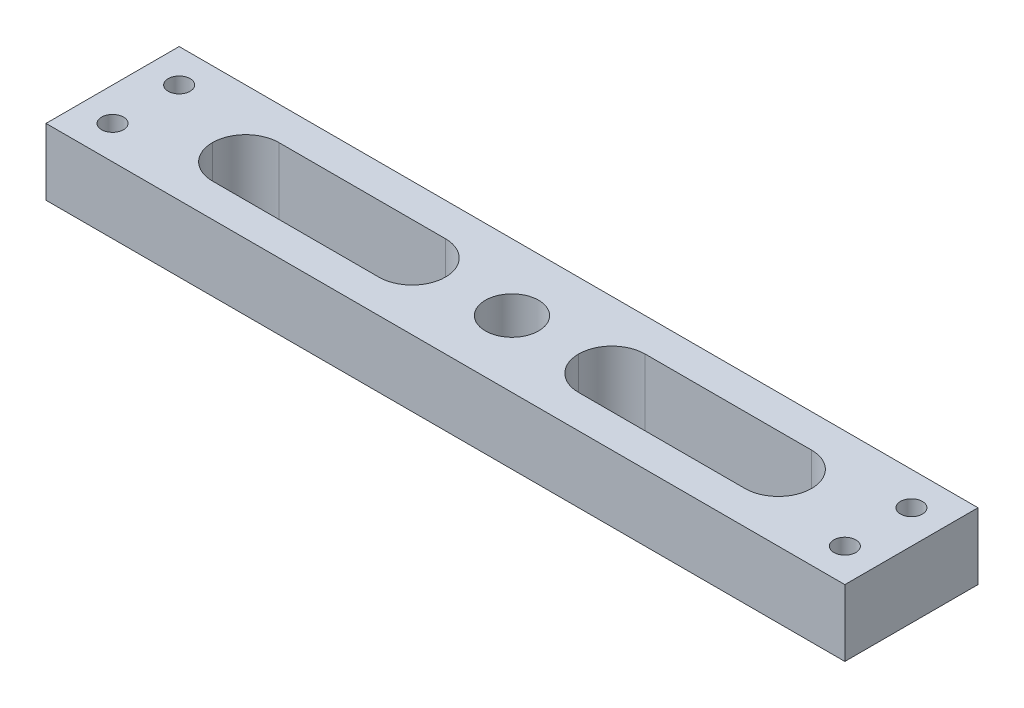
ISO-10303-21;
HEADER;
FILE_DESCRIPTION(('STEP AP214'),'2;1');
FILE_NAME('part.step','',(''),(''),'','','');
FILE_SCHEMA(('AUTOMOTIVE_DESIGN { 1 0 10303 214 1 1 1 1 }'));
ENDSEC;
DATA;
#1=APPLICATION_CONTEXT('core data for automotive mechanical design processes');
#2=APPLICATION_PROTOCOL_DEFINITION('international standard','automotive_design',2000,#1);
#3=PRODUCT_CONTEXT('',#1,'mechanical');
#4=PRODUCT('Part','Part','',(#3));
#5=PRODUCT_RELATED_PRODUCT_CATEGORY('part','',(#4));
#6=PRODUCT_DEFINITION_FORMATION('','',#4);
#7=PRODUCT_DEFINITION_CONTEXT('part definition',#1,'design');
#8=PRODUCT_DEFINITION('design','',#6,#7);
#9=PRODUCT_DEFINITION_SHAPE('','',#8);
#10=(LENGTH_UNIT() NAMED_UNIT(*) SI_UNIT(.MILLI.,.METRE.));
#11=(NAMED_UNIT(*) PLANE_ANGLE_UNIT() SI_UNIT($,.RADIAN.));
#12=(NAMED_UNIT(*) SI_UNIT($,.STERADIAN.) SOLID_ANGLE_UNIT());
#13=UNCERTAINTY_MEASURE_WITH_UNIT(LENGTH_MEASURE(1.E-05),#10,'distance_accuracy_value','');
#14=(GEOMETRIC_REPRESENTATION_CONTEXT(3) GLOBAL_UNCERTAINTY_ASSIGNED_CONTEXT((#13)) GLOBAL_UNIT_ASSIGNED_CONTEXT((#10,
#11,#12)) REPRESENTATION_CONTEXT('',''));
#15=CARTESIAN_POINT('',(0.,0.,0.));
#16=DIRECTION('',(0.,0.,1.));
#17=DIRECTION('',(1.,0.,0.));
#18=AXIS2_PLACEMENT_3D('',#15,#16,#17);
#19=CARTESIAN_POINT('',(0.,0.,0.));
#20=DIRECTION('',(0.,-1.,0.));
#21=DIRECTION('',(0.,0.,-1.));
#22=AXIS2_PLACEMENT_3D('',#19,#20,#21);
#23=PLANE('',#22);
#24=CARTESIAN_POINT('',(-115.,0.,5.00000000000002));
#25=DIRECTION('',(0.,1.,0.));
#26=DIRECTION('',(0.,0.,1.));
#27=AXIS2_PLACEMENT_3D('',#24,#25,#26);
#28=CIRCLE('',#27,1.65);
#29=CARTESIAN_POINT('',(-115.,0.,6.65000000000002));
#30=VERTEX_POINT('',#29);
#31=EDGE_CURVE('E361',#30,#30,#28,.T.);
#32=ORIENTED_EDGE('',*,*,#31,.T.);
#33=EDGE_LOOP('',(#32));
#34=FACE_BOUND('',#33,.T.);
#35=CARTESIAN_POINT('',(-115.,0.,15.));
#36=DIRECTION('',(0.,1.,0.));
#37=DIRECTION('',(0.,0.,1.));
#38=AXIS2_PLACEMENT_3D('',#35,#36,#37);
#39=CIRCLE('',#38,1.65);
#40=CARTESIAN_POINT('',(-115.,0.,16.65));
#41=VERTEX_POINT('',#40);
#42=EDGE_CURVE('E371',#41,#41,#39,.T.);
#43=ORIENTED_EDGE('',*,*,#42,.T.);
#44=EDGE_LOOP('',(#43));
#45=FACE_BOUND('',#44,.T.);
#46=CARTESIAN_POINT('',(-5.,0.,5.));
#47=DIRECTION('',(0.,1.,0.));
#48=DIRECTION('',(0.,0.,1.));
#49=AXIS2_PLACEMENT_3D('',#46,#47,#48);
#50=CIRCLE('',#49,1.65);
#51=CARTESIAN_POINT('',(-5.,0.,6.65));
#52=VERTEX_POINT('',#51);
#53=EDGE_CURVE('E251',#52,#52,#50,.T.);
#54=ORIENTED_EDGE('',*,*,#53,.T.);
#55=EDGE_LOOP('',(#54));
#56=FACE_BOUND('',#55,.T.);
#57=DIRECTION('',(1.,0.,0.));
#58=VECTOR('',#57,1.);
#59=CARTESIAN_POINT('',(-105.,0.,15.));
#60=LINE('',#59,#58);
#61=CARTESIAN_POINT('',(-100.,0.,15.));
#62=VERTEX_POINT('',#61);
#63=CARTESIAN_POINT('',(-75.,0.,15.));
#64=VERTEX_POINT('',#63);
#65=EDGE_CURVE('E233',#62,#64,#60,.T.);
#66=ORIENTED_EDGE('',*,*,#65,.T.);
#67=CARTESIAN_POINT('',(-75.,0.,10.));
#68=DIRECTION('',(0.,-1.,0.));
#69=DIRECTION('',(0.,0.,-1.));
#70=AXIS2_PLACEMENT_3D('',#67,#68,#69);
#71=CIRCLE('',#70,5.);
#72=CARTESIAN_POINT('',(-70.,0.,10.));
#73=VERTEX_POINT('',#72);
#74=EDGE_CURVE('E46',#64,#73,#71,.F.);
#75=ORIENTED_EDGE('',*,*,#74,.T.);
#76=CARTESIAN_POINT('',(-75.,0.,10.));
#77=DIRECTION('',(0.,-1.,0.));
#78=DIRECTION('',(0.,0.,-1.));
#79=AXIS2_PLACEMENT_3D('',#76,#77,#78);
#80=CIRCLE('',#79,5.);
#81=CARTESIAN_POINT('',(-75.,0.,5.00000000000001));
#82=VERTEX_POINT('',#81);
#83=EDGE_CURVE('E226',#73,#82,#80,.F.);
#84=ORIENTED_EDGE('',*,*,#83,.T.);
#85=DIRECTION('',(-1.,0.,0.));
#86=VECTOR('',#85,1.);
#87=CARTESIAN_POINT('',(-105.,0.,5.00000000000001));
#88=LINE('',#87,#86);
#89=CARTESIAN_POINT('',(-100.,0.,5.00000000000001));
#90=VERTEX_POINT('',#89);
#91=EDGE_CURVE('E259',#82,#90,#88,.T.);
#92=ORIENTED_EDGE('',*,*,#91,.T.);
#93=CARTESIAN_POINT('',(-100.,0.,10.));
#94=DIRECTION('',(0.,-1.,0.));
#95=DIRECTION('',(0.,0.,-1.));
#96=AXIS2_PLACEMENT_3D('',#93,#94,#95);
#97=CIRCLE('',#96,5.);
#98=CARTESIAN_POINT('',(-105.,0.,10.));
#99=VERTEX_POINT('',#98);
#100=EDGE_CURVE('E218',#90,#99,#97,.F.);
#101=ORIENTED_EDGE('',*,*,#100,.T.);
#102=CARTESIAN_POINT('',(-100.,0.,10.));
#103=DIRECTION('',(0.,-1.,0.));
#104=DIRECTION('',(0.,0.,-1.));
#105=AXIS2_PLACEMENT_3D('',#102,#103,#104);
#106=CIRCLE('',#105,5.);
#107=EDGE_CURVE('E222',#99,#62,#106,.F.);
#108=ORIENTED_EDGE('',*,*,#107,.T.);
#109=EDGE_LOOP('',(#66,#75,#84,#92,#101,#108));
#110=FACE_BOUND('',#109,.T.);
#111=DIRECTION('',(-1.,0.,0.));
#112=VECTOR('',#111,1.);
#113=CARTESIAN_POINT('',(-15.,0.,5.00000000000001));
#114=LINE('',#113,#112);
#115=CARTESIAN_POINT('',(-20.,0.,5.00000000000001));
#116=VERTEX_POINT('',#115);
#117=CARTESIAN_POINT('',(-45.,0.,5.00000000000002));
#118=VERTEX_POINT('',#117);
#119=EDGE_CURVE('E262',#116,#118,#114,.T.);
#120=ORIENTED_EDGE('',*,*,#119,.T.);
#121=CARTESIAN_POINT('',(-45.,0.,10.));
#122=DIRECTION('',(0.,-1.,0.));
#123=DIRECTION('',(0.,0.,-1.));
#124=AXIS2_PLACEMENT_3D('',#121,#122,#123);
#125=CIRCLE('',#124,5.);
#126=CARTESIAN_POINT('',(-50.,0.,10.));
#127=VERTEX_POINT('',#126);
#128=EDGE_CURVE('E214',#118,#127,#125,.F.);
#129=ORIENTED_EDGE('',*,*,#128,.T.);
#130=CARTESIAN_POINT('',(-45.,0.,10.));
#131=DIRECTION('',(0.,-1.,0.));
#132=DIRECTION('',(0.,0.,-1.));
#133=AXIS2_PLACEMENT_3D('',#130,#131,#132);
#134=CIRCLE('',#133,5.);
#135=CARTESIAN_POINT('',(-45.,0.,15.));
#136=VERTEX_POINT('',#135);
#137=EDGE_CURVE('E210',#127,#136,#134,.F.);
#138=ORIENTED_EDGE('',*,*,#137,.T.);
#139=DIRECTION('',(1.,0.,0.));
#140=VECTOR('',#139,1.);
#141=CARTESIAN_POINT('',(-15.,0.,15.));
#142=LINE('',#141,#140);
#143=CARTESIAN_POINT('',(-20.,0.,15.));
#144=VERTEX_POINT('',#143);
#145=EDGE_CURVE('E270',#136,#144,#142,.T.);
#146=ORIENTED_EDGE('',*,*,#145,.T.);
#147=CARTESIAN_POINT('',(-20.,0.,10.));
#148=DIRECTION('',(0.,-1.,0.));
#149=DIRECTION('',(0.,0.,-1.));
#150=AXIS2_PLACEMENT_3D('',#147,#148,#149);
#151=CIRCLE('',#150,5.);
#152=CARTESIAN_POINT('',(-15.,0.,10.));
#153=VERTEX_POINT('',#152);
#154=EDGE_CURVE('E202',#144,#153,#151,.F.);
#155=ORIENTED_EDGE('',*,*,#154,.T.);
#156=CARTESIAN_POINT('',(-20.,0.,10.));
#157=DIRECTION('',(0.,-1.,0.));
#158=DIRECTION('',(0.,0.,-1.));
#159=AXIS2_PLACEMENT_3D('',#156,#157,#158);
#160=CIRCLE('',#159,5.);
#161=EDGE_CURVE('E206',#153,#116,#160,.F.);
#162=ORIENTED_EDGE('',*,*,#161,.T.);
#163=EDGE_LOOP('',(#120,#129,#138,#146,#155,#162));
#164=FACE_BOUND('',#163,.T.);
#165=CARTESIAN_POINT('',(-60.,0.,9.99999999999999));
#166=DIRECTION('',(0.,1.,0.));
#167=DIRECTION('',(0.,0.,1.));
#168=AXIS2_PLACEMENT_3D('',#165,#166,#167);
#169=CIRCLE('',#168,4.);
#170=CARTESIAN_POINT('',(-60.,0.,14.));
#171=VERTEX_POINT('',#170);
#172=EDGE_CURVE('E273',#171,#171,#169,.T.);
#173=ORIENTED_EDGE('',*,*,#172,.T.);
#174=EDGE_LOOP('',(#173));
#175=FACE_BOUND('',#174,.T.);
#176=DIRECTION('',(0.,0.,-1.));
#177=VECTOR('',#176,1.);
#178=CARTESIAN_POINT('',(0.,0.,0.));
#179=LINE('',#178,#177);
#180=CARTESIAN_POINT('',(0.,0.,20.));
#181=VERTEX_POINT('',#180);
#182=CARTESIAN_POINT('',(0.,0.,0.));
#183=VERTEX_POINT('',#182);
#184=EDGE_CURVE('E176',#181,#183,#179,.T.);
#185=ORIENTED_EDGE('',*,*,#184,.F.);
#186=DIRECTION('',(1.,0.,0.));
#187=VECTOR('',#186,1.);
#188=CARTESIAN_POINT('',(0.,0.,20.));
#189=LINE('',#188,#187);
#190=CARTESIAN_POINT('',(-120.,0.,20.));
#191=VERTEX_POINT('',#190);
#192=EDGE_CURVE('E172',#191,#181,#189,.T.);
#193=ORIENTED_EDGE('',*,*,#192,.F.);
#194=DIRECTION('',(0.,0.,1.));
#195=VECTOR('',#194,1.);
#196=CARTESIAN_POINT('',(-120.,0.,0.));
#197=LINE('',#196,#195);
#198=CARTESIAN_POINT('',(-120.,0.,0.));
#199=VERTEX_POINT('',#198);
#200=EDGE_CURVE('E289',#199,#191,#197,.T.);
#201=ORIENTED_EDGE('',*,*,#200,.F.);
#202=DIRECTION('',(-1.,0.,0.));
#203=VECTOR('',#202,1.);
#204=CARTESIAN_POINT('',(0.,0.,0.));
#205=LINE('',#204,#203);
#206=EDGE_CURVE('E287',#183,#199,#205,.T.);
#207=ORIENTED_EDGE('',*,*,#206,.F.);
#208=EDGE_LOOP('',(#185,#193,#201,#207));
#209=FACE_BOUND('',#208,.T.);
#210=CARTESIAN_POINT('',(-5.,0.,15.));
#211=DIRECTION('',(0.,1.,0.));
#212=DIRECTION('',(0.,0.,1.));
#213=AXIS2_PLACEMENT_3D('',#210,#211,#212);
#214=CIRCLE('',#213,1.65);
#215=CARTESIAN_POINT('',(-5.,0.,16.65));
#216=VERTEX_POINT('',#215);
#217=EDGE_CURVE('E242',#216,#216,#214,.T.);
#218=ORIENTED_EDGE('',*,*,#217,.T.);
#219=EDGE_LOOP('',(#218));
#220=FACE_BOUND('',#219,.T.);
#221=ADVANCED_FACE('F37',(#34,#45,#56,#110,#164,#175,#209,#220),#23,.T.);
#222=CARTESIAN_POINT('',(0.,10.,0.));
#223=DIRECTION('',(0.,-1.,0.));
#224=DIRECTION('',(0.,0.,-1.));
#225=AXIS2_PLACEMENT_3D('',#222,#223,#224);
#226=PLANE('',#225);
#227=CARTESIAN_POINT('',(-115.,10.,5.00000000000002));
#228=DIRECTION('',(0.,1.,0.));
#229=DIRECTION('',(0.,0.,1.));
#230=AXIS2_PLACEMENT_3D('',#227,#228,#229);
#231=CIRCLE('',#230,1.64999999999998);
#232=CARTESIAN_POINT('',(-115.,10.,6.65000000000001));
#233=VERTEX_POINT('',#232);
#234=EDGE_CURVE('E364',#233,#233,#231,.T.);
#235=ORIENTED_EDGE('',*,*,#234,.F.);
#236=EDGE_LOOP('',(#235));
#237=FACE_BOUND('',#236,.T.);
#238=CARTESIAN_POINT('',(-115.,10.,15.));
#239=DIRECTION('',(0.,1.,0.));
#240=DIRECTION('',(0.,0.,1.));
#241=AXIS2_PLACEMENT_3D('',#238,#239,#240);
#242=CIRCLE('',#241,1.64999999999998);
#243=CARTESIAN_POINT('',(-115.,10.,16.65));
#244=VERTEX_POINT('',#243);
#245=EDGE_CURVE('E366',#244,#244,#242,.T.);
#246=ORIENTED_EDGE('',*,*,#245,.F.);
#247=EDGE_LOOP('',(#246));
#248=FACE_BOUND('',#247,.T.);
#249=CARTESIAN_POINT('',(-5.,10.,5.));
#250=DIRECTION('',(0.,1.,0.));
#251=DIRECTION('',(0.,0.,1.));
#252=AXIS2_PLACEMENT_3D('',#249,#250,#251);
#253=CIRCLE('',#252,1.64999999999999);
#254=CARTESIAN_POINT('',(-5.,10.,6.64999999999999));
#255=VERTEX_POINT('',#254);
#256=EDGE_CURVE('E374',#255,#255,#253,.T.);
#257=ORIENTED_EDGE('',*,*,#256,.F.);
#258=EDGE_LOOP('',(#257));
#259=FACE_BOUND('',#258,.T.);
#260=CARTESIAN_POINT('',(-5.,10.,15.));
#261=DIRECTION('',(0.,1.,0.));
#262=DIRECTION('',(0.,0.,1.));
#263=AXIS2_PLACEMENT_3D('',#260,#261,#262);
#264=CIRCLE('',#263,1.64999999999999);
#265=CARTESIAN_POINT('',(-5.,10.,16.65));
#266=VERTEX_POINT('',#265);
#267=EDGE_CURVE('E246',#266,#266,#264,.T.);
#268=ORIENTED_EDGE('',*,*,#267,.F.);
#269=EDGE_LOOP('',(#268));
#270=FACE_BOUND('',#269,.T.);
#271=DIRECTION('',(-1.,0.,0.));
#272=VECTOR('',#271,1.);
#273=CARTESIAN_POINT('',(-15.,10.,5.00000000000001));
#274=LINE('',#273,#272);
#275=CARTESIAN_POINT('',(-20.,10.,5.00000000000001));
#276=VERTEX_POINT('',#275);
#277=CARTESIAN_POINT('',(-45.,10.,5.00000000000002));
#278=VERTEX_POINT('',#277);
#279=EDGE_CURVE('E266',#276,#278,#274,.T.);
#280=ORIENTED_EDGE('',*,*,#279,.F.);
#281=CARTESIAN_POINT('',(-20.,10.,10.));
#282=DIRECTION('',(0.,-1.,0.));
#283=DIRECTION('',(0.,0.,-1.));
#284=AXIS2_PLACEMENT_3D('',#281,#282,#283);
#285=CIRCLE('',#284,5.);
#286=CARTESIAN_POINT('',(-15.,10.,10.));
#287=VERTEX_POINT('',#286);
#288=EDGE_CURVE('E208',#276,#287,#285,.T.);
#289=ORIENTED_EDGE('',*,*,#288,.T.);
#290=CARTESIAN_POINT('',(-20.,10.,10.));
#291=DIRECTION('',(0.,-1.,0.));
#292=DIRECTION('',(0.,0.,-1.));
#293=AXIS2_PLACEMENT_3D('',#290,#291,#292);
#294=CIRCLE('',#293,5.);
#295=CARTESIAN_POINT('',(-20.,10.,15.));
#296=VERTEX_POINT('',#295);
#297=EDGE_CURVE('E204',#287,#296,#294,.T.);
#298=ORIENTED_EDGE('',*,*,#297,.T.);
#299=DIRECTION('',(1.,0.,0.));
#300=VECTOR('',#299,1.);
#301=CARTESIAN_POINT('',(-15.,10.,15.));
#302=LINE('',#301,#300);
#303=CARTESIAN_POINT('',(-45.,10.,15.));
#304=VERTEX_POINT('',#303);
#305=EDGE_CURVE('E269',#304,#296,#302,.T.);
#306=ORIENTED_EDGE('',*,*,#305,.F.);
#307=CARTESIAN_POINT('',(-45.,10.,10.));
#308=DIRECTION('',(0.,-1.,0.));
#309=DIRECTION('',(0.,0.,-1.));
#310=AXIS2_PLACEMENT_3D('',#307,#308,#309);
#311=CIRCLE('',#310,5.);
#312=CARTESIAN_POINT('',(-50.,10.,10.));
#313=VERTEX_POINT('',#312);
#314=EDGE_CURVE('E212',#304,#313,#311,.T.);
#315=ORIENTED_EDGE('',*,*,#314,.T.);
#316=CARTESIAN_POINT('',(-45.,10.,10.));
#317=DIRECTION('',(0.,-1.,0.));
#318=DIRECTION('',(0.,0.,-1.));
#319=AXIS2_PLACEMENT_3D('',#316,#317,#318);
#320=CIRCLE('',#319,5.);
#321=EDGE_CURVE('E216',#313,#278,#320,.T.);
#322=ORIENTED_EDGE('',*,*,#321,.T.);
#323=EDGE_LOOP('',(#280,#289,#298,#306,#315,#322));
#324=FACE_BOUND('',#323,.T.);
#325=DIRECTION('',(0.,0.,-1.));
#326=VECTOR('',#325,1.);
#327=CARTESIAN_POINT('',(0.,10.,0.));
#328=LINE('',#327,#326);
#329=CARTESIAN_POINT('',(0.,10.,20.));
#330=VERTEX_POINT('',#329);
#331=CARTESIAN_POINT('',(0.,10.,0.));
#332=VERTEX_POINT('',#331);
#333=EDGE_CURVE('E162',#330,#332,#328,.T.);
#334=ORIENTED_EDGE('',*,*,#333,.T.);
#335=DIRECTION('',(-1.,0.,0.));
#336=VECTOR('',#335,1.);
#337=CARTESIAN_POINT('',(0.,10.,0.));
#338=LINE('',#337,#336);
#339=CARTESIAN_POINT('',(-120.,10.,0.));
#340=VERTEX_POINT('',#339);
#341=EDGE_CURVE('E151',#332,#340,#338,.T.);
#342=ORIENTED_EDGE('',*,*,#341,.T.);
#343=DIRECTION('',(0.,0.,1.));
#344=VECTOR('',#343,1.);
#345=CARTESIAN_POINT('',(-120.,10.,0.));
#346=LINE('',#345,#344);
#347=CARTESIAN_POINT('',(-120.,10.,20.));
#348=VERTEX_POINT('',#347);
#349=EDGE_CURVE('E161',#340,#348,#346,.T.);
#350=ORIENTED_EDGE('',*,*,#349,.T.);
#351=DIRECTION('',(1.,0.,0.));
#352=VECTOR('',#351,1.);
#353=CARTESIAN_POINT('',(0.,10.,20.));
#354=LINE('',#353,#352);
#355=EDGE_CURVE('E168',#348,#330,#354,.T.);
#356=ORIENTED_EDGE('',*,*,#355,.T.);
#357=EDGE_LOOP('',(#334,#342,#350,#356));
#358=FACE_BOUND('',#357,.T.);
#359=CARTESIAN_POINT('',(-60.,10.,9.99999999999999));
#360=DIRECTION('',(0.,1.,0.));
#361=DIRECTION('',(0.,0.,1.));
#362=AXIS2_PLACEMENT_3D('',#359,#360,#361);
#363=CIRCLE('',#362,4.);
#364=CARTESIAN_POINT('',(-60.,10.,14.));
#365=VERTEX_POINT('',#364);
#366=EDGE_CURVE('E278',#365,#365,#363,.T.);
#367=ORIENTED_EDGE('',*,*,#366,.F.);
#368=EDGE_LOOP('',(#367));
#369=FACE_BOUND('',#368,.T.);
#370=DIRECTION('',(1.,0.,0.));
#371=VECTOR('',#370,1.);
#372=CARTESIAN_POINT('',(-105.,10.,15.));
#373=LINE('',#372,#371);
#374=CARTESIAN_POINT('',(-100.,10.,15.));
#375=VERTEX_POINT('',#374);
#376=CARTESIAN_POINT('',(-75.,10.,15.));
#377=VERTEX_POINT('',#376);
#378=EDGE_CURVE('E255',#375,#377,#373,.T.);
#379=ORIENTED_EDGE('',*,*,#378,.F.);
#380=CARTESIAN_POINT('',(-100.,10.,10.));
#381=DIRECTION('',(0.,-1.,0.));
#382=DIRECTION('',(0.,0.,-1.));
#383=AXIS2_PLACEMENT_3D('',#380,#381,#382);
#384=CIRCLE('',#383,5.);
#385=CARTESIAN_POINT('',(-105.,10.,10.));
#386=VERTEX_POINT('',#385);
#387=EDGE_CURVE('E224',#375,#386,#384,.T.);
#388=ORIENTED_EDGE('',*,*,#387,.T.);
#389=CARTESIAN_POINT('',(-100.,10.,10.));
#390=DIRECTION('',(0.,-1.,0.));
#391=DIRECTION('',(0.,0.,-1.));
#392=AXIS2_PLACEMENT_3D('',#389,#390,#391);
#393=CIRCLE('',#392,5.);
#394=CARTESIAN_POINT('',(-100.,10.,5.00000000000001));
#395=VERTEX_POINT('',#394);
#396=EDGE_CURVE('E220',#386,#395,#393,.T.);
#397=ORIENTED_EDGE('',*,*,#396,.T.);
#398=DIRECTION('',(-1.,0.,0.));
#399=VECTOR('',#398,1.);
#400=CARTESIAN_POINT('',(-105.,10.,5.00000000000001));
#401=LINE('',#400,#399);
#402=CARTESIAN_POINT('',(-75.,10.,5.00000000000001));
#403=VERTEX_POINT('',#402);
#404=EDGE_CURVE('E258',#403,#395,#401,.T.);
#405=ORIENTED_EDGE('',*,*,#404,.F.);
#406=CARTESIAN_POINT('',(-75.,10.,10.));
#407=DIRECTION('',(0.,-1.,0.));
#408=DIRECTION('',(0.,0.,-1.));
#409=AXIS2_PLACEMENT_3D('',#406,#407,#408);
#410=CIRCLE('',#409,5.);
#411=CARTESIAN_POINT('',(-70.,10.,10.));
#412=VERTEX_POINT('',#411);
#413=EDGE_CURVE('E53',#403,#412,#410,.T.);
#414=ORIENTED_EDGE('',*,*,#413,.T.);
#415=CARTESIAN_POINT('',(-75.,10.,10.));
#416=DIRECTION('',(0.,-1.,0.));
#417=DIRECTION('',(0.,0.,-1.));
#418=AXIS2_PLACEMENT_3D('',#415,#416,#417);
#419=CIRCLE('',#418,5.);
#420=EDGE_CURVE('E11',#412,#377,#419,.T.);
#421=ORIENTED_EDGE('',*,*,#420,.T.);
#422=EDGE_LOOP('',(#379,#388,#397,#405,#414,#421));
#423=FACE_BOUND('',#422,.T.);
#424=ADVANCED_FACE('F165',(#237,#248,#259,#270,#324,#358,#369,#423),#226,.F.);
#425=CARTESIAN_POINT('',(0.,10.,0.));
#426=DIRECTION('',(-1.,0.,0.));
#427=DIRECTION('',(0.,0.,1.));
#428=AXIS2_PLACEMENT_3D('',#425,#426,#427);
#429=PLANE('',#428);
#430=ORIENTED_EDGE('',*,*,#184,.T.);
#431=DIRECTION('',(0.,-1.,0.));
#432=VECTOR('',#431,1.);
#433=CARTESIAN_POINT('',(0.,10.,0.));
#434=LINE('',#433,#432);
#435=EDGE_CURVE('E155',#332,#183,#434,.T.);
#436=ORIENTED_EDGE('',*,*,#435,.F.);
#437=ORIENTED_EDGE('',*,*,#333,.F.);
#438=DIRECTION('',(0.,-1.,0.));
#439=VECTOR('',#438,1.);
#440=CARTESIAN_POINT('',(0.,10.,20.));
#441=LINE('',#440,#439);
#442=EDGE_CURVE('E285',#330,#181,#441,.T.);
#443=ORIENTED_EDGE('',*,*,#442,.T.);
#444=EDGE_LOOP('',(#430,#436,#437,#443));
#445=FACE_BOUND('',#444,.T.);
#446=ADVANCED_FACE('F174',(#445),#429,.F.);
#447=CARTESIAN_POINT('',(0.,10.,0.));
#448=DIRECTION('',(0.,0.,1.));
#449=DIRECTION('',(1.,0.,0.));
#450=AXIS2_PLACEMENT_3D('',#447,#448,#449);
#451=PLANE('',#450);
#452=ORIENTED_EDGE('',*,*,#206,.T.);
#453=DIRECTION('',(0.,-1.,0.));
#454=VECTOR('',#453,1.);
#455=CARTESIAN_POINT('',(-120.,10.,0.));
#456=LINE('',#455,#454);
#457=EDGE_CURVE('E158',#340,#199,#456,.T.);
#458=ORIENTED_EDGE('',*,*,#457,.F.);
#459=ORIENTED_EDGE('',*,*,#341,.F.);
#460=ORIENTED_EDGE('',*,*,#435,.T.);
#461=EDGE_LOOP('',(#452,#458,#459,#460));
#462=FACE_BOUND('',#461,.T.);
#463=ADVANCED_FACE('F153',(#462),#451,.F.);
#464=CARTESIAN_POINT('',(-120.,10.,0.));
#465=DIRECTION('',(1.,0.,0.));
#466=DIRECTION('',(0.,0.,-1.));
#467=AXIS2_PLACEMENT_3D('',#464,#465,#466);
#468=PLANE('',#467);
#469=ORIENTED_EDGE('',*,*,#200,.T.);
#470=DIRECTION('',(0.,-1.,0.));
#471=VECTOR('',#470,1.);
#472=CARTESIAN_POINT('',(-120.,10.,20.));
#473=LINE('',#472,#471);
#474=EDGE_CURVE('E182',#348,#191,#473,.T.);
#475=ORIENTED_EDGE('',*,*,#474,.F.);
#476=ORIENTED_EDGE('',*,*,#349,.F.);
#477=ORIENTED_EDGE('',*,*,#457,.T.);
#478=EDGE_LOOP('',(#469,#475,#476,#477));
#479=FACE_BOUND('',#478,.T.);
#480=ADVANCED_FACE('F300',(#479),#468,.F.);
#481=CARTESIAN_POINT('',(0.,10.,20.));
#482=DIRECTION('',(0.,0.,-1.));
#483=DIRECTION('',(-1.,0.,0.));
#484=AXIS2_PLACEMENT_3D('',#481,#482,#483);
#485=PLANE('',#484);
#486=ORIENTED_EDGE('',*,*,#192,.T.);
#487=ORIENTED_EDGE('',*,*,#442,.F.);
#488=ORIENTED_EDGE('',*,*,#355,.F.);
#489=ORIENTED_EDGE('',*,*,#474,.T.);
#490=EDGE_LOOP('',(#486,#487,#488,#489));
#491=FACE_BOUND('',#490,.T.);
#492=ADVANCED_FACE('F296',(#491),#485,.F.);
#493=CARTESIAN_POINT('',(-60.,10.,9.99999999999999));
#494=DIRECTION('',(0.,-1.,0.));
#495=DIRECTION('',(0.,0.,-1.));
#496=AXIS2_PLACEMENT_3D('',#493,#494,#495);
#497=CYLINDRICAL_SURFACE('',#496,4.);
#498=ORIENTED_EDGE('',*,*,#366,.T.);
#499=EDGE_LOOP('',(#498));
#500=FACE_BOUND('',#499,.T.);
#501=ORIENTED_EDGE('',*,*,#172,.F.);
#502=EDGE_LOOP('',(#501));
#503=FACE_BOUND('',#502,.T.);
#504=ADVANCED_FACE('F307',(#500,#503),#497,.F.);
#505=CARTESIAN_POINT('',(-15.,10.,5.00000000000001));
#506=DIRECTION('',(0.,0.,1.));
#507=DIRECTION('',(1.,0.,0.));
#508=AXIS2_PLACEMENT_3D('',#505,#506,#507);
#509=PLANE('',#508);
#510=ORIENTED_EDGE('',*,*,#119,.F.);
#511=DIRECTION('',(0.,-1.,0.));
#512=VECTOR('',#511,1.);
#513=CARTESIAN_POINT('',(-20.,10.,5.00000000000001));
#514=LINE('',#513,#512);
#515=EDGE_CURVE('E190',#116,#276,#514,.F.);
#516=ORIENTED_EDGE('',*,*,#515,.T.);
#517=ORIENTED_EDGE('',*,*,#279,.T.);
#518=DIRECTION('',(0.,-1.,0.));
#519=VECTOR('',#518,1.);
#520=CARTESIAN_POINT('',(-45.,0.,5.00000000000002));
#521=LINE('',#520,#519);
#522=EDGE_CURVE('E188',#278,#118,#521,.T.);
#523=ORIENTED_EDGE('',*,*,#522,.T.);
#524=EDGE_LOOP('',(#510,#516,#517,#523));
#525=FACE_BOUND('',#524,.T.);
#526=ADVANCED_FACE('F323',(#525),#509,.T.);
#527=CARTESIAN_POINT('',(-15.,10.,15.));
#528=DIRECTION('',(0.,0.,-1.));
#529=DIRECTION('',(-1.,0.,0.));
#530=AXIS2_PLACEMENT_3D('',#527,#528,#529);
#531=PLANE('',#530);
#532=ORIENTED_EDGE('',*,*,#305,.T.);
#533=DIRECTION('',(0.,-1.,0.));
#534=VECTOR('',#533,1.);
#535=CARTESIAN_POINT('',(-20.,0.,15.));
#536=LINE('',#535,#534);
#537=EDGE_CURVE('E180',#296,#144,#536,.T.);
#538=ORIENTED_EDGE('',*,*,#537,.T.);
#539=ORIENTED_EDGE('',*,*,#145,.F.);
#540=DIRECTION('',(0.,-1.,0.));
#541=VECTOR('',#540,1.);
#542=CARTESIAN_POINT('',(-45.,10.,15.));
#543=LINE('',#542,#541);
#544=EDGE_CURVE('E177',#136,#304,#543,.F.);
#545=ORIENTED_EDGE('',*,*,#544,.T.);
#546=EDGE_LOOP('',(#532,#538,#539,#545));
#547=FACE_BOUND('',#546,.T.);
#548=ADVANCED_FACE('F327',(#547),#531,.T.);
#549=CARTESIAN_POINT('',(-105.,10.,15.));
#550=DIRECTION('',(0.,0.,-1.));
#551=DIRECTION('',(-1.,0.,0.));
#552=AXIS2_PLACEMENT_3D('',#549,#550,#551);
#553=PLANE('',#552);
#554=ORIENTED_EDGE('',*,*,#65,.F.);
#555=DIRECTION('',(0.,-1.,0.));
#556=VECTOR('',#555,1.);
#557=CARTESIAN_POINT('',(-100.,10.,15.));
#558=LINE('',#557,#556);
#559=EDGE_CURVE('E200',#62,#375,#558,.F.);
#560=ORIENTED_EDGE('',*,*,#559,.T.);
#561=ORIENTED_EDGE('',*,*,#378,.T.);
#562=DIRECTION('',(0.,-1.,0.));
#563=VECTOR('',#562,1.);
#564=CARTESIAN_POINT('',(-75.,0.,15.));
#565=LINE('',#564,#563);
#566=EDGE_CURVE('E198',#377,#64,#565,.T.);
#567=ORIENTED_EDGE('',*,*,#566,.T.);
#568=EDGE_LOOP('',(#554,#560,#561,#567));
#569=FACE_BOUND('',#568,.T.);
#570=ADVANCED_FACE('F331',(#569),#553,.T.);
#571=CARTESIAN_POINT('',(-105.,10.,5.00000000000001));
#572=DIRECTION('',(0.,0.,1.));
#573=DIRECTION('',(1.,0.,0.));
#574=AXIS2_PLACEMENT_3D('',#571,#572,#573);
#575=PLANE('',#574);
#576=ORIENTED_EDGE('',*,*,#404,.T.);
#577=DIRECTION('',(0.,-1.,0.));
#578=VECTOR('',#577,1.);
#579=CARTESIAN_POINT('',(-100.,0.,5.00000000000001));
#580=LINE('',#579,#578);
#581=EDGE_CURVE('E195',#395,#90,#580,.T.);
#582=ORIENTED_EDGE('',*,*,#581,.T.);
#583=ORIENTED_EDGE('',*,*,#91,.F.);
#584=DIRECTION('',(0.,-1.,0.));
#585=VECTOR('',#584,1.);
#586=CARTESIAN_POINT('',(-75.,10.,5.00000000000001));
#587=LINE('',#586,#585);
#588=EDGE_CURVE('E192',#82,#403,#587,.F.);
#589=ORIENTED_EDGE('',*,*,#588,.T.);
#590=EDGE_LOOP('',(#576,#582,#583,#589));
#591=FACE_BOUND('',#590,.T.);
#592=ADVANCED_FACE('F335',(#591),#575,.T.);
#593=CARTESIAN_POINT('',(-20.,10.,10.));
#594=DIRECTION('',(0.,1.,0.));
#595=DIRECTION('',(0.,0.,1.));
#596=AXIS2_PLACEMENT_3D('',#593,#594,#595);
#597=CYLINDRICAL_SURFACE('',#596,5.);
#598=DIRECTION('',(0.,-1.,0.));
#599=VECTOR('',#598,1.);
#600=CARTESIAN_POINT('',(-15.,0.,10.));
#601=LINE('',#600,#599);
#602=EDGE_CURVE('E230',#287,#153,#601,.T.);
#603=ORIENTED_EDGE('',*,*,#602,.F.);
#604=ORIENTED_EDGE('',*,*,#288,.F.);
#605=ORIENTED_EDGE('',*,*,#515,.F.);
#606=ORIENTED_EDGE('',*,*,#161,.F.);
#607=EDGE_LOOP('',(#603,#604,#605,#606));
#608=FACE_BOUND('',#607,.T.);
#609=ADVANCED_FACE('F339',(#608),#597,.F.);
#610=CARTESIAN_POINT('',(-20.,10.,10.));
#611=DIRECTION('',(0.,1.,0.));
#612=DIRECTION('',(0.,0.,1.));
#613=AXIS2_PLACEMENT_3D('',#610,#611,#612);
#614=CYLINDRICAL_SURFACE('',#613,5.);
#615=ORIENTED_EDGE('',*,*,#297,.F.);
#616=ORIENTED_EDGE('',*,*,#602,.T.);
#617=ORIENTED_EDGE('',*,*,#154,.F.);
#618=ORIENTED_EDGE('',*,*,#537,.F.);
#619=EDGE_LOOP('',(#615,#616,#617,#618));
#620=FACE_BOUND('',#619,.T.);
#621=ADVANCED_FACE('F396',(#620),#614,.F.);
#622=CARTESIAN_POINT('',(-45.,10.,10.));
#623=DIRECTION('',(0.,1.,0.));
#624=DIRECTION('',(0.,0.,1.));
#625=AXIS2_PLACEMENT_3D('',#622,#623,#624);
#626=CYLINDRICAL_SURFACE('',#625,5.);
#627=ORIENTED_EDGE('',*,*,#522,.F.);
#628=ORIENTED_EDGE('',*,*,#321,.F.);
#629=DIRECTION('',(0.,-1.,0.));
#630=VECTOR('',#629,1.);
#631=CARTESIAN_POINT('',(-50.,10.,10.));
#632=LINE('',#631,#630);
#633=EDGE_CURVE('E234',#127,#313,#632,.F.);
#634=ORIENTED_EDGE('',*,*,#633,.F.);
#635=ORIENTED_EDGE('',*,*,#128,.F.);
#636=EDGE_LOOP('',(#627,#628,#634,#635));
#637=FACE_BOUND('',#636,.T.);
#638=ADVANCED_FACE('F405',(#637),#626,.F.);
#639=CARTESIAN_POINT('',(-45.,10.,10.));
#640=DIRECTION('',(0.,1.,0.));
#641=DIRECTION('',(0.,0.,1.));
#642=AXIS2_PLACEMENT_3D('',#639,#640,#641);
#643=CYLINDRICAL_SURFACE('',#642,5.);
#644=ORIENTED_EDGE('',*,*,#314,.F.);
#645=ORIENTED_EDGE('',*,*,#544,.F.);
#646=ORIENTED_EDGE('',*,*,#137,.F.);
#647=ORIENTED_EDGE('',*,*,#633,.T.);
#648=EDGE_LOOP('',(#644,#645,#646,#647));
#649=FACE_BOUND('',#648,.T.);
#650=ADVANCED_FACE('F402',(#649),#643,.F.);
#651=CARTESIAN_POINT('',(-100.,10.,10.));
#652=DIRECTION('',(0.,1.,0.));
#653=DIRECTION('',(0.,0.,1.));
#654=AXIS2_PLACEMENT_3D('',#651,#652,#653);
#655=CYLINDRICAL_SURFACE('',#654,5.);
#656=DIRECTION('',(0.,-1.,0.));
#657=VECTOR('',#656,1.);
#658=CARTESIAN_POINT('',(-105.,0.,10.));
#659=LINE('',#658,#657);
#660=EDGE_CURVE('E236',#386,#99,#659,.T.);
#661=ORIENTED_EDGE('',*,*,#660,.F.);
#662=ORIENTED_EDGE('',*,*,#387,.F.);
#663=ORIENTED_EDGE('',*,*,#559,.F.);
#664=ORIENTED_EDGE('',*,*,#107,.F.);
#665=EDGE_LOOP('',(#661,#662,#663,#664));
#666=FACE_BOUND('',#665,.T.);
#667=ADVANCED_FACE('F418',(#666),#655,.F.);
#668=CARTESIAN_POINT('',(-100.,10.,10.));
#669=DIRECTION('',(0.,1.,0.));
#670=DIRECTION('',(0.,0.,1.));
#671=AXIS2_PLACEMENT_3D('',#668,#669,#670);
#672=CYLINDRICAL_SURFACE('',#671,5.);
#673=ORIENTED_EDGE('',*,*,#396,.F.);
#674=ORIENTED_EDGE('',*,*,#660,.T.);
#675=ORIENTED_EDGE('',*,*,#100,.F.);
#676=ORIENTED_EDGE('',*,*,#581,.F.);
#677=EDGE_LOOP('',(#673,#674,#675,#676));
#678=FACE_BOUND('',#677,.T.);
#679=ADVANCED_FACE('F423',(#678),#672,.F.);
#680=CARTESIAN_POINT('',(-75.,10.,10.));
#681=DIRECTION('',(0.,1.,0.));
#682=DIRECTION('',(0.,0.,1.));
#683=AXIS2_PLACEMENT_3D('',#680,#681,#682);
#684=CYLINDRICAL_SURFACE('',#683,5.);
#685=ORIENTED_EDGE('',*,*,#566,.F.);
#686=ORIENTED_EDGE('',*,*,#420,.F.);
#687=DIRECTION('',(0.,-1.,0.));
#688=VECTOR('',#687,1.);
#689=CARTESIAN_POINT('',(-70.,10.,10.));
#690=LINE('',#689,#688);
#691=EDGE_CURVE('E41',#73,#412,#690,.F.);
#692=ORIENTED_EDGE('',*,*,#691,.F.);
#693=ORIENTED_EDGE('',*,*,#74,.F.);
#694=EDGE_LOOP('',(#685,#686,#692,#693));
#695=FACE_BOUND('',#694,.T.);
#696=ADVANCED_FACE('F39',(#695),#684,.F.);
#697=CARTESIAN_POINT('',(-75.,10.,10.));
#698=DIRECTION('',(0.,1.,0.));
#699=DIRECTION('',(0.,0.,1.));
#700=AXIS2_PLACEMENT_3D('',#697,#698,#699);
#701=CYLINDRICAL_SURFACE('',#700,5.);
#702=ORIENTED_EDGE('',*,*,#413,.F.);
#703=ORIENTED_EDGE('',*,*,#588,.F.);
#704=ORIENTED_EDGE('',*,*,#83,.F.);
#705=ORIENTED_EDGE('',*,*,#691,.T.);
#706=EDGE_LOOP('',(#702,#703,#704,#705));
#707=FACE_BOUND('',#706,.T.);
#708=ADVANCED_FACE('F345',(#707),#701,.F.);
#709=CARTESIAN_POINT('',(-5.,10.,15.));
#710=DIRECTION('',(0.,1.,0.));
#711=DIRECTION('',(0.,0.,1.));
#712=AXIS2_PLACEMENT_3D('',#709,#710,#711);
#713=CYLINDRICAL_SURFACE('',#712,1.64999999999999);
#714=ORIENTED_EDGE('',*,*,#217,.F.);
#715=EDGE_LOOP('',(#714));
#716=FACE_BOUND('',#715,.T.);
#717=ORIENTED_EDGE('',*,*,#267,.T.);
#718=EDGE_LOOP('',(#717));
#719=FACE_BOUND('',#718,.T.);
#720=ADVANCED_FACE('F341',(#716,#719),#713,.F.);
#721=CARTESIAN_POINT('',(-5.,10.,5.));
#722=DIRECTION('',(0.,1.,0.));
#723=DIRECTION('',(0.,0.,1.));
#724=AXIS2_PLACEMENT_3D('',#721,#722,#723);
#725=CYLINDRICAL_SURFACE('',#724,1.64999999999999);
#726=ORIENTED_EDGE('',*,*,#53,.F.);
#727=EDGE_LOOP('',(#726));
#728=FACE_BOUND('',#727,.T.);
#729=ORIENTED_EDGE('',*,*,#256,.T.);
#730=EDGE_LOOP('',(#729));
#731=FACE_BOUND('',#730,.T.);
#732=ADVANCED_FACE('F344',(#728,#731),#725,.F.);
#733=CARTESIAN_POINT('',(-115.,10.,15.));
#734=DIRECTION('',(0.,1.,0.));
#735=DIRECTION('',(0.,0.,1.));
#736=AXIS2_PLACEMENT_3D('',#733,#734,#735);
#737=CYLINDRICAL_SURFACE('',#736,1.64999999999999);
#738=ORIENTED_EDGE('',*,*,#42,.F.);
#739=EDGE_LOOP('',(#738));
#740=FACE_BOUND('',#739,.T.);
#741=ORIENTED_EDGE('',*,*,#245,.T.);
#742=EDGE_LOOP('',(#741));
#743=FACE_BOUND('',#742,.T.);
#744=ADVANCED_FACE('F349',(#740,#743),#737,.F.);
#745=CARTESIAN_POINT('',(-115.,10.,5.00000000000002));
#746=DIRECTION('',(0.,1.,0.));
#747=DIRECTION('',(0.,0.,1.));
#748=AXIS2_PLACEMENT_3D('',#745,#746,#747);
#749=CYLINDRICAL_SURFACE('',#748,1.64999999999999);
#750=ORIENTED_EDGE('',*,*,#31,.F.);
#751=EDGE_LOOP('',(#750));
#752=FACE_BOUND('',#751,.T.);
#753=ORIENTED_EDGE('',*,*,#234,.T.);
#754=EDGE_LOOP('',(#753));
#755=FACE_BOUND('',#754,.T.);
#756=ADVANCED_FACE('F353',(#752,#755),#749,.F.);
#757=CLOSED_SHELL('',(#221,#424,#446,#463,#480,#492,#504,#526,#548,#570,#592,#609,#621,#638,
#650,#667,#679,#696,#708,#720,#732,#744,#756));
#758=MANIFOLD_SOLID_BREP('B2',#757);
#759=ADVANCED_BREP_SHAPE_REPRESENTATION('',(#18,#758),#14);
#760=SHAPE_DEFINITION_REPRESENTATION(#9,#759);
ENDSEC;
END-ISO-10303-21;
